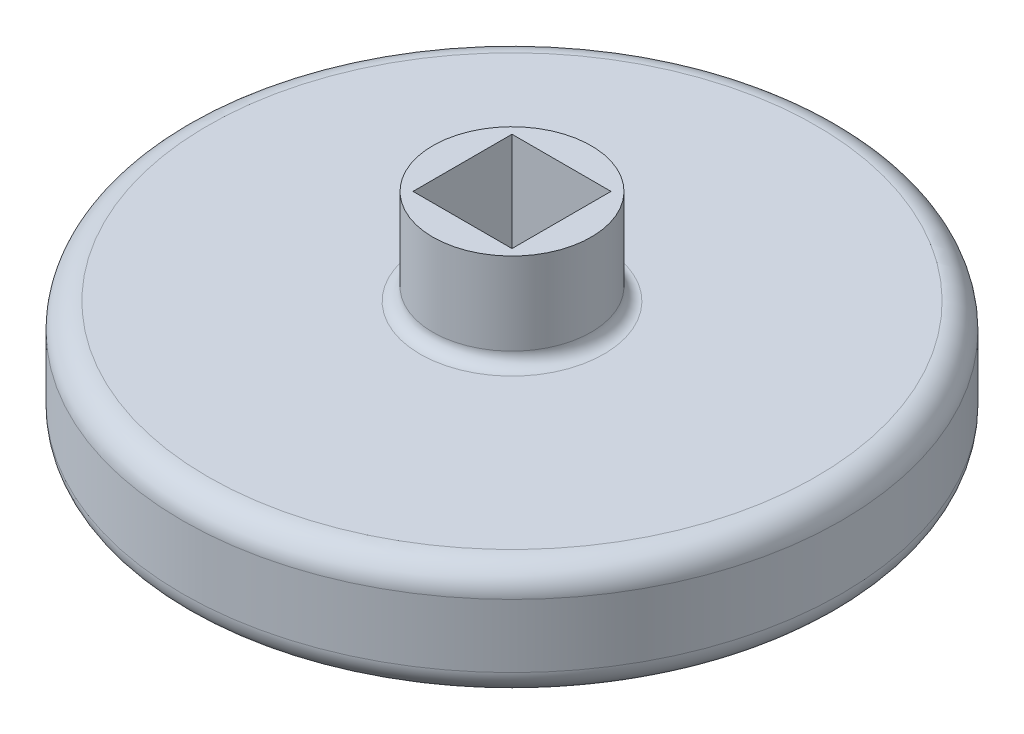
ISO-10303-21;
HEADER;
FILE_DESCRIPTION(('STEP AP214'),'2;1');
FILE_NAME('part.step','',(''),(''),'','','');
FILE_SCHEMA(('AUTOMOTIVE_DESIGN { 1 0 10303 214 1 1 1 1 }'));
ENDSEC;
DATA;
#1=APPLICATION_CONTEXT('core data for automotive mechanical design processes');
#2=APPLICATION_PROTOCOL_DEFINITION('international standard','automotive_design',2000,#1);
#3=PRODUCT_CONTEXT('',#1,'mechanical');
#4=PRODUCT('Part','Part','',(#3));
#5=PRODUCT_RELATED_PRODUCT_CATEGORY('part','',(#4));
#6=PRODUCT_DEFINITION_FORMATION('','',#4);
#7=PRODUCT_DEFINITION_CONTEXT('part definition',#1,'design');
#8=PRODUCT_DEFINITION('design','',#6,#7);
#9=PRODUCT_DEFINITION_SHAPE('','',#8);
#10=(LENGTH_UNIT() NAMED_UNIT(*) SI_UNIT(.MILLI.,.METRE.));
#11=(NAMED_UNIT(*) PLANE_ANGLE_UNIT() SI_UNIT($,.RADIAN.));
#12=(NAMED_UNIT(*) SI_UNIT($,.STERADIAN.) SOLID_ANGLE_UNIT());
#13=UNCERTAINTY_MEASURE_WITH_UNIT(LENGTH_MEASURE(1.E-05),#10,'distance_accuracy_value','');
#14=(GEOMETRIC_REPRESENTATION_CONTEXT(3) GLOBAL_UNCERTAINTY_ASSIGNED_CONTEXT((#13)) GLOBAL_UNIT_ASSIGNED_CONTEXT((#10,
#11,#12)) REPRESENTATION_CONTEXT('',''));
#15=CARTESIAN_POINT('',(0.,0.,0.));
#16=DIRECTION('',(0.,0.,1.));
#17=DIRECTION('',(1.,0.,0.));
#18=AXIS2_PLACEMENT_3D('',#15,#16,#17);
#19=CARTESIAN_POINT('',(0.,11.43,0.));
#20=DIRECTION('',(0.,-1.,0.));
#21=DIRECTION('',(0.,0.,-1.));
#22=AXIS2_PLACEMENT_3D('',#19,#20,#21);
#23=CYLINDRICAL_SURFACE('',#22,33.02);
#24=CARTESIAN_POINT('',(0.,2.54,0.));
#25=DIRECTION('',(0.,1.,0.));
#26=DIRECTION('',(0.,0.,1.));
#27=AXIS2_PLACEMENT_3D('',#24,#25,#26);
#28=CIRCLE('',#27,33.02);
#29=CARTESIAN_POINT('',(0.,2.54,33.02));
#30=VERTEX_POINT('',#29);
#31=EDGE_CURVE('E118',#30,#30,#28,.T.);
#32=ORIENTED_EDGE('',*,*,#31,.T.);
#33=EDGE_LOOP('',(#32));
#34=FACE_BOUND('',#33,.T.);
#35=CARTESIAN_POINT('',(0.,8.89,0.));
#36=DIRECTION('',(0.,1.,0.));
#37=DIRECTION('',(0.,0.,1.));
#38=AXIS2_PLACEMENT_3D('',#35,#36,#37);
#39=CIRCLE('',#38,33.02);
#40=CARTESIAN_POINT('',(0.,8.89,33.02));
#41=VERTEX_POINT('',#40);
#42=EDGE_CURVE('E115',#41,#41,#39,.F.);
#43=ORIENTED_EDGE('',*,*,#42,.T.);
#44=EDGE_LOOP('',(#43));
#45=FACE_BOUND('',#44,.T.);
#46=ADVANCED_FACE('F32',(#34,#45),#23,.T.);
#47=CARTESIAN_POINT('',(0.,11.43,0.));
#48=DIRECTION('',(0.,1.,0.));
#49=DIRECTION('',(0.,0.,1.));
#50=AXIS2_PLACEMENT_3D('',#47,#48,#49);
#51=PLANE('',#50);
#52=CARTESIAN_POINT('',(0.,11.43,0.));
#53=DIRECTION('',(0.,1.,0.));
#54=DIRECTION('',(0.,0.,1.));
#55=AXIS2_PLACEMENT_3D('',#52,#53,#54);
#56=CIRCLE('',#55,9.2075);
#57=CARTESIAN_POINT('',(0.,11.43,9.2075));
#58=VERTEX_POINT('',#57);
#59=EDGE_CURVE('E11',#58,#58,#56,.F.);
#60=ORIENTED_EDGE('',*,*,#59,.T.);
#61=EDGE_LOOP('',(#60));
#62=FACE_BOUND('',#61,.T.);
#63=CARTESIAN_POINT('',(0.,11.43,0.));
#64=DIRECTION('',(0.,1.,0.));
#65=DIRECTION('',(0.,0.,1.));
#66=AXIS2_PLACEMENT_3D('',#63,#64,#65);
#67=CIRCLE('',#66,30.48);
#68=CARTESIAN_POINT('',(0.,11.43,30.48));
#69=VERTEX_POINT('',#68);
#70=EDGE_CURVE('E124',#69,#69,#67,.T.);
#71=ORIENTED_EDGE('',*,*,#70,.T.);
#72=EDGE_LOOP('',(#71));
#73=FACE_BOUND('',#72,.T.);
#74=ADVANCED_FACE('F151',(#62,#73),#51,.T.);
#75=CARTESIAN_POINT('',(0.,0.,0.));
#76=DIRECTION('',(0.,1.,0.));
#77=DIRECTION('',(0.,0.,1.));
#78=AXIS2_PLACEMENT_3D('',#75,#76,#77);
#79=PLANE('',#78);
#80=CARTESIAN_POINT('',(0.,0.,0.));
#81=DIRECTION('',(0.,1.,0.));
#82=DIRECTION('',(0.,0.,1.));
#83=AXIS2_PLACEMENT_3D('',#80,#81,#82);
#84=CIRCLE('',#83,9.2075);
#85=CARTESIAN_POINT('',(0.,0.,9.2075));
#86=VERTEX_POINT('',#85);
#87=EDGE_CURVE('E127',#86,#86,#84,.T.);
#88=ORIENTED_EDGE('',*,*,#87,.T.);
#89=EDGE_LOOP('',(#88));
#90=FACE_BOUND('',#89,.T.);
#91=CARTESIAN_POINT('',(0.,0.,0.));
#92=DIRECTION('',(0.,1.,0.));
#93=DIRECTION('',(0.,0.,1.));
#94=AXIS2_PLACEMENT_3D('',#91,#92,#93);
#95=CIRCLE('',#94,30.48);
#96=CARTESIAN_POINT('',(0.,0.,30.48));
#97=VERTEX_POINT('',#96);
#98=EDGE_CURVE('E121',#97,#97,#95,.F.);
#99=ORIENTED_EDGE('',*,*,#98,.T.);
#100=EDGE_LOOP('',(#99));
#101=FACE_BOUND('',#100,.T.);
#102=ADVANCED_FACE('F157',(#90,#101),#79,.F.);
#103=CARTESIAN_POINT('',(0.,2.54,0.));
#104=DIRECTION('',(0.,1.,0.));
#105=DIRECTION('',(0.,0.,1.));
#106=AXIS2_PLACEMENT_3D('',#103,#104,#105);
#107=TOROIDAL_SURFACE('',#106,30.48,2.54);
#108=ORIENTED_EDGE('',*,*,#98,.F.);
#109=EDGE_LOOP('',(#108));
#110=FACE_BOUND('',#109,.T.);
#111=ORIENTED_EDGE('',*,*,#31,.F.);
#112=EDGE_LOOP('',(#111));
#113=FACE_BOUND('',#112,.T.);
#114=ADVANCED_FACE('F163',(#110,#113),#107,.T.);
#115=CARTESIAN_POINT('',(0.,8.89,0.));
#116=DIRECTION('',(0.,1.,0.));
#117=DIRECTION('',(0.,0.,1.));
#118=AXIS2_PLACEMENT_3D('',#115,#116,#117);
#119=TOROIDAL_SURFACE('',#118,30.48,2.54);
#120=ORIENTED_EDGE('',*,*,#42,.F.);
#121=EDGE_LOOP('',(#120));
#122=FACE_BOUND('',#121,.T.);
#123=ORIENTED_EDGE('',*,*,#70,.F.);
#124=EDGE_LOOP('',(#123));
#125=FACE_BOUND('',#124,.T.);
#126=ADVANCED_FACE('F166',(#122,#125),#119,.T.);
#127=CARTESIAN_POINT('',(0.,-9.525,0.));
#128=DIRECTION('',(0.,1.,0.));
#129=DIRECTION('',(0.,0.,1.));
#130=AXIS2_PLACEMENT_3D('',#127,#128,#129);
#131=PLANE('',#130);
#132=DIRECTION('',(-1.,0.,0.));
#133=VECTOR('',#132,1.);
#134=CARTESIAN_POINT('',(4.9609375,-9.525,-4.9609375));
#135=LINE('',#134,#133);
#136=CARTESIAN_POINT('',(4.9609375,-9.525,-4.9609375));
#137=VERTEX_POINT('',#136);
#138=CARTESIAN_POINT('',(-4.9609375,-9.525,-4.9609375));
#139=VERTEX_POINT('',#138);
#140=EDGE_CURVE('E102',#137,#139,#135,.T.);
#141=ORIENTED_EDGE('',*,*,#140,.T.);
#142=DIRECTION('',(0.,0.,1.));
#143=VECTOR('',#142,1.);
#144=CARTESIAN_POINT('',(-4.9609375,-9.525,4.9609375));
#145=LINE('',#144,#143);
#146=CARTESIAN_POINT('',(-4.9609375,-9.525,4.9609375));
#147=VERTEX_POINT('',#146);
#148=EDGE_CURVE('E93',#139,#147,#145,.T.);
#149=ORIENTED_EDGE('',*,*,#148,.T.);
#150=DIRECTION('',(1.,0.,0.));
#151=VECTOR('',#150,1.);
#152=CARTESIAN_POINT('',(4.9609375,-9.525,4.9609375));
#153=LINE('',#152,#151);
#154=CARTESIAN_POINT('',(4.9609375,-9.525,4.9609375));
#155=VERTEX_POINT('',#154);
#156=EDGE_CURVE('E99',#147,#155,#153,.T.);
#157=ORIENTED_EDGE('',*,*,#156,.T.);
#158=DIRECTION('',(0.,0.,-1.));
#159=VECTOR('',#158,1.);
#160=CARTESIAN_POINT('',(4.9609375,-9.525,4.9609375));
#161=LINE('',#160,#159);
#162=EDGE_CURVE('E47',#155,#137,#161,.T.);
#163=ORIENTED_EDGE('',*,*,#162,.T.);
#164=EDGE_LOOP('',(#141,#149,#157,#163));
#165=FACE_BOUND('',#164,.T.);
#166=CARTESIAN_POINT('',(0.,-9.525,0.));
#167=DIRECTION('',(0.,1.,0.));
#168=DIRECTION('',(0.,0.,1.));
#169=AXIS2_PLACEMENT_3D('',#166,#167,#168);
#170=CIRCLE('',#169,7.9375);
#171=CARTESIAN_POINT('',(0.,-9.525,7.9375));
#172=VERTEX_POINT('',#171);
#173=EDGE_CURVE('E112',#172,#172,#170,.T.);
#174=ORIENTED_EDGE('',*,*,#173,.F.);
#175=EDGE_LOOP('',(#174));
#176=FACE_BOUND('',#175,.T.);
#177=ADVANCED_FACE('F169',(#165,#176),#131,.F.);
#178=CARTESIAN_POINT('',(0.,-9.525,0.));
#179=DIRECTION('',(0.,1.,0.));
#180=DIRECTION('',(0.,0.,1.));
#181=AXIS2_PLACEMENT_3D('',#178,#179,#180);
#182=CYLINDRICAL_SURFACE('',#181,7.9375);
#183=CARTESIAN_POINT('',(0.,-1.27,0.));
#184=DIRECTION('',(0.,1.,0.));
#185=DIRECTION('',(0.,0.,1.));
#186=AXIS2_PLACEMENT_3D('',#183,#184,#185);
#187=CIRCLE('',#186,7.9375);
#188=CARTESIAN_POINT('',(0.,-1.27,7.9375));
#189=VERTEX_POINT('',#188);
#190=EDGE_CURVE('E130',#189,#189,#187,.F.);
#191=ORIENTED_EDGE('',*,*,#190,.T.);
#192=EDGE_LOOP('',(#191));
#193=FACE_BOUND('',#192,.T.);
#194=ORIENTED_EDGE('',*,*,#173,.T.);
#195=EDGE_LOOP('',(#194));
#196=FACE_BOUND('',#195,.T.);
#197=ADVANCED_FACE('F174',(#193,#196),#182,.T.);
#198=CARTESIAN_POINT('',(0.,12.7,0.));
#199=DIRECTION('',(0.,1.,0.));
#200=DIRECTION('',(0.,0.,1.));
#201=AXIS2_PLACEMENT_3D('',#198,#199,#200);
#202=CIRCLE('',#201,7.9375);
#203=CARTESIAN_POINT('',(0.,12.7,7.9375));
#204=VERTEX_POINT('',#203);
#205=EDGE_CURVE('E40',#204,#204,#202,.T.);
#206=ORIENTED_EDGE('',*,*,#205,.T.);
#207=EDGE_LOOP('',(#206));
#208=FACE_BOUND('',#207,.T.);
#209=CARTESIAN_POINT('',(0.,20.955,0.));
#210=DIRECTION('',(0.,1.,0.));
#211=DIRECTION('',(0.,0.,1.));
#212=AXIS2_PLACEMENT_3D('',#209,#210,#211);
#213=CIRCLE('',#212,7.9375);
#214=CARTESIAN_POINT('',(0.,20.955,7.9375));
#215=VERTEX_POINT('',#214);
#216=EDGE_CURVE('E107',#215,#215,#213,.T.);
#217=ORIENTED_EDGE('',*,*,#216,.F.);
#218=EDGE_LOOP('',(#217));
#219=FACE_BOUND('',#218,.T.);
#220=ADVANCED_FACE('F135',(#208,#219),#182,.T.);
#221=CARTESIAN_POINT('',(0.,20.955,0.));
#222=DIRECTION('',(0.,1.,0.));
#223=DIRECTION('',(0.,0.,1.));
#224=AXIS2_PLACEMENT_3D('',#221,#222,#223);
#225=PLANE('',#224);
#226=DIRECTION('',(0.,0.,1.));
#227=VECTOR('',#226,1.);
#228=CARTESIAN_POINT('',(-4.9609375,20.955,4.9609375));
#229=LINE('',#228,#227);
#230=CARTESIAN_POINT('',(-4.9609375,20.955,-4.9609375));
#231=VERTEX_POINT('',#230);
#232=CARTESIAN_POINT('',(-4.9609375,20.955,4.9609375));
#233=VERTEX_POINT('',#232);
#234=EDGE_CURVE('E55',#231,#233,#229,.T.);
#235=ORIENTED_EDGE('',*,*,#234,.F.);
#236=DIRECTION('',(-1.,0.,0.));
#237=VECTOR('',#236,1.);
#238=CARTESIAN_POINT('',(4.9609375,20.955,-4.9609375));
#239=LINE('',#238,#237);
#240=CARTESIAN_POINT('',(4.9609375,20.955,-4.9609375));
#241=VERTEX_POINT('',#240);
#242=EDGE_CURVE('E91',#241,#231,#239,.T.);
#243=ORIENTED_EDGE('',*,*,#242,.F.);
#244=DIRECTION('',(0.,0.,-1.));
#245=VECTOR('',#244,1.);
#246=CARTESIAN_POINT('',(4.9609375,20.955,4.9609375));
#247=LINE('',#246,#245);
#248=CARTESIAN_POINT('',(4.9609375,20.955,4.9609375));
#249=VERTEX_POINT('',#248);
#250=EDGE_CURVE('E75',#249,#241,#247,.T.);
#251=ORIENTED_EDGE('',*,*,#250,.F.);
#252=DIRECTION('',(1.,0.,0.));
#253=VECTOR('',#252,1.);
#254=CARTESIAN_POINT('',(4.9609375,20.955,4.9609375));
#255=LINE('',#254,#253);
#256=EDGE_CURVE('E84',#233,#249,#255,.T.);
#257=ORIENTED_EDGE('',*,*,#256,.F.);
#258=EDGE_LOOP('',(#235,#243,#251,#257));
#259=FACE_BOUND('',#258,.T.);
#260=ORIENTED_EDGE('',*,*,#216,.T.);
#261=EDGE_LOOP('',(#260));
#262=FACE_BOUND('',#261,.T.);
#263=ADVANCED_FACE('F88',(#259,#262),#225,.T.);
#264=CARTESIAN_POINT('',(0.,-1.27,0.));
#265=DIRECTION('',(0.,1.,0.));
#266=DIRECTION('',(0.,0.,1.));
#267=AXIS2_PLACEMENT_3D('',#264,#265,#266);
#268=TOROIDAL_SURFACE('',#267,9.2075,1.27);
#269=ORIENTED_EDGE('',*,*,#190,.F.);
#270=EDGE_LOOP('',(#269));
#271=FACE_BOUND('',#270,.T.);
#272=ORIENTED_EDGE('',*,*,#87,.F.);
#273=EDGE_LOOP('',(#272));
#274=FACE_BOUND('',#273,.T.);
#275=ADVANCED_FACE('F140',(#271,#274),#268,.F.);
#276=CARTESIAN_POINT('',(0.,12.7,0.));
#277=DIRECTION('',(0.,1.,0.));
#278=DIRECTION('',(0.,0.,1.));
#279=AXIS2_PLACEMENT_3D('',#276,#277,#278);
#280=TOROIDAL_SURFACE('',#279,9.2075,1.27);
#281=ORIENTED_EDGE('',*,*,#59,.F.);
#282=EDGE_LOOP('',(#281));
#283=FACE_BOUND('',#282,.T.);
#284=ORIENTED_EDGE('',*,*,#205,.F.);
#285=EDGE_LOOP('',(#284));
#286=FACE_BOUND('',#285,.T.);
#287=ADVANCED_FACE('F34',(#283,#286),#280,.F.);
#288=CARTESIAN_POINT('',(-4.9609375,-9.525,4.9609375));
#289=DIRECTION('',(-1.,0.,0.));
#290=DIRECTION('',(0.,0.,1.));
#291=AXIS2_PLACEMENT_3D('',#288,#289,#290);
#292=PLANE('',#291);
#293=DIRECTION('',(0.,1.,0.));
#294=VECTOR('',#293,1.);
#295=CARTESIAN_POINT('',(-4.9609375,-9.525,4.9609375));
#296=LINE('',#295,#294);
#297=EDGE_CURVE('E81',#147,#233,#296,.T.);
#298=ORIENTED_EDGE('',*,*,#297,.F.);
#299=ORIENTED_EDGE('',*,*,#148,.F.);
#300=DIRECTION('',(0.,1.,0.));
#301=VECTOR('',#300,1.);
#302=CARTESIAN_POINT('',(-4.9609375,-9.525,-4.9609375));
#303=LINE('',#302,#301);
#304=EDGE_CURVE('E105',#139,#231,#303,.T.);
#305=ORIENTED_EDGE('',*,*,#304,.T.);
#306=ORIENTED_EDGE('',*,*,#234,.T.);
#307=EDGE_LOOP('',(#298,#299,#305,#306));
#308=FACE_BOUND('',#307,.T.);
#309=ADVANCED_FACE('F139',(#308),#292,.F.);
#310=CARTESIAN_POINT('',(4.9609375,-9.525,-4.9609375));
#311=DIRECTION('',(0.,0.,-1.));
#312=DIRECTION('',(-1.,0.,0.));
#313=AXIS2_PLACEMENT_3D('',#310,#311,#312);
#314=PLANE('',#313);
#315=ORIENTED_EDGE('',*,*,#304,.F.);
#316=ORIENTED_EDGE('',*,*,#140,.F.);
#317=DIRECTION('',(0.,1.,0.));
#318=VECTOR('',#317,1.);
#319=CARTESIAN_POINT('',(4.9609375,-9.525,-4.9609375));
#320=LINE('',#319,#318);
#321=EDGE_CURVE('E80',#137,#241,#320,.T.);
#322=ORIENTED_EDGE('',*,*,#321,.T.);
#323=ORIENTED_EDGE('',*,*,#242,.T.);
#324=EDGE_LOOP('',(#315,#316,#322,#323));
#325=FACE_BOUND('',#324,.T.);
#326=ADVANCED_FACE('F146',(#325),#314,.F.);
#327=CARTESIAN_POINT('',(4.9609375,-9.525,4.9609375));
#328=DIRECTION('',(1.,0.,0.));
#329=DIRECTION('',(0.,0.,-1.));
#330=AXIS2_PLACEMENT_3D('',#327,#328,#329);
#331=PLANE('',#330);
#332=ORIENTED_EDGE('',*,*,#321,.F.);
#333=ORIENTED_EDGE('',*,*,#162,.F.);
#334=DIRECTION('',(0.,1.,0.));
#335=VECTOR('',#334,1.);
#336=CARTESIAN_POINT('',(4.9609375,-9.525,4.9609375));
#337=LINE('',#336,#335);
#338=EDGE_CURVE('E71',#155,#249,#337,.T.);
#339=ORIENTED_EDGE('',*,*,#338,.T.);
#340=ORIENTED_EDGE('',*,*,#250,.T.);
#341=EDGE_LOOP('',(#332,#333,#339,#340));
#342=FACE_BOUND('',#341,.T.);
#343=ADVANCED_FACE('F73',(#342),#331,.F.);
#344=CARTESIAN_POINT('',(4.9609375,-9.525,4.9609375));
#345=DIRECTION('',(0.,0.,1.));
#346=DIRECTION('',(1.,0.,0.));
#347=AXIS2_PLACEMENT_3D('',#344,#345,#346);
#348=PLANE('',#347);
#349=ORIENTED_EDGE('',*,*,#338,.F.);
#350=ORIENTED_EDGE('',*,*,#156,.F.);
#351=ORIENTED_EDGE('',*,*,#297,.T.);
#352=ORIENTED_EDGE('',*,*,#256,.T.);
#353=EDGE_LOOP('',(#349,#350,#351,#352));
#354=FACE_BOUND('',#353,.T.);
#355=ADVANCED_FACE('F85',(#354),#348,.F.);
#356=CLOSED_SHELL('',(#46,#74,#102,#114,#126,#177,#197,#220,#263,#275,#287,#309,#326,#343,#355));
#357=MANIFOLD_SOLID_BREP('B2',#356);
#358=ADVANCED_BREP_SHAPE_REPRESENTATION('',(#18,#357),#14);
#359=SHAPE_DEFINITION_REPRESENTATION(#9,#358);
ENDSEC;
END-ISO-10303-21;
